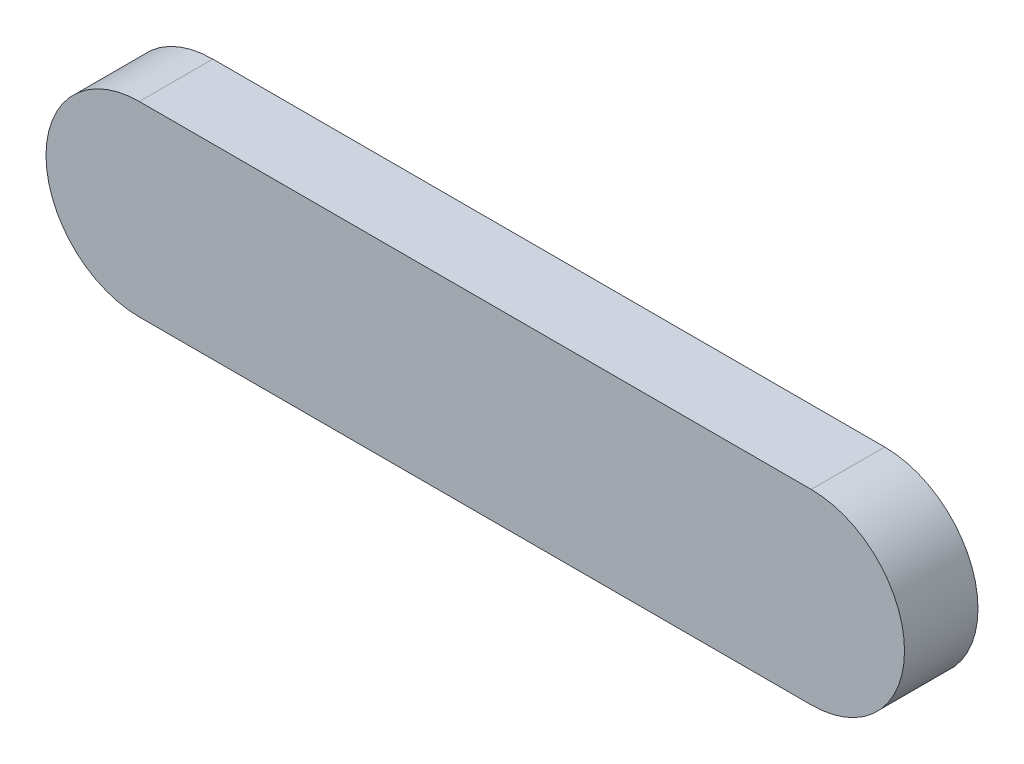
ISO-10303-21;
HEADER;
FILE_DESCRIPTION(('STEP AP214'),'2;1');
FILE_NAME('part.step','',(''),(''),'','','');
FILE_SCHEMA(('AUTOMOTIVE_DESIGN { 1 0 10303 214 1 1 1 1 }'));
ENDSEC;
DATA;
#1=APPLICATION_CONTEXT('core data for automotive mechanical design processes');
#2=APPLICATION_PROTOCOL_DEFINITION('international standard','automotive_design',2000,#1);
#3=PRODUCT_CONTEXT('',#1,'mechanical');
#4=PRODUCT('Part','Part','',(#3));
#5=PRODUCT_RELATED_PRODUCT_CATEGORY('part','',(#4));
#6=PRODUCT_DEFINITION_FORMATION('','',#4);
#7=PRODUCT_DEFINITION_CONTEXT('part definition',#1,'design');
#8=PRODUCT_DEFINITION('design','',#6,#7);
#9=PRODUCT_DEFINITION_SHAPE('','',#8);
#10=(LENGTH_UNIT() NAMED_UNIT(*) SI_UNIT(.MILLI.,.METRE.));
#11=(NAMED_UNIT(*) PLANE_ANGLE_UNIT() SI_UNIT($,.RADIAN.));
#12=(NAMED_UNIT(*) SI_UNIT($,.STERADIAN.) SOLID_ANGLE_UNIT());
#13=UNCERTAINTY_MEASURE_WITH_UNIT(LENGTH_MEASURE(1.E-05),#10,'distance_accuracy_value','');
#14=(GEOMETRIC_REPRESENTATION_CONTEXT(3) GLOBAL_UNCERTAINTY_ASSIGNED_CONTEXT((#13)) GLOBAL_UNIT_ASSIGNED_CONTEXT((#10,
#11,#12)) REPRESENTATION_CONTEXT('',''));
#15=CARTESIAN_POINT('',(0.,0.,0.));
#16=DIRECTION('',(0.,0.,1.));
#17=DIRECTION('',(1.,0.,0.));
#18=AXIS2_PLACEMENT_3D('',#15,#16,#17);
#19=CARTESIAN_POINT('',(89.7636,75.438,0.));
#20=DIRECTION('',(0.,1.,0.));
#21=DIRECTION('',(1.,0.,0.));
#22=AXIS2_PLACEMENT_3D('',#19,#20,#21);
#23=PLANE('',#22);
#24=DIRECTION('',(1.,0.,0.));
#25=VECTOR('',#24,1.);
#26=CARTESIAN_POINT('',(89.7636,75.438,0.1999996));
#27=LINE('',#26,#25);
#28=CARTESIAN_POINT('',(89.7636,75.438,0.1999996));
#29=VERTEX_POINT('',#28);
#30=CARTESIAN_POINT('',(91.5924,75.438,0.1999996));
#31=VERTEX_POINT('',#30);
#32=EDGE_CURVE('E11',#29,#31,#27,.T.);
#33=ORIENTED_EDGE('',*,*,#32,.F.);
#34=DIRECTION('',(0.,0.,1.));
#35=VECTOR('',#34,1.);
#36=CARTESIAN_POINT('',(89.7636,75.438,0.));
#37=LINE('',#36,#35);
#38=CARTESIAN_POINT('',(89.7636,75.438,0.));
#39=VERTEX_POINT('',#38);
#40=EDGE_CURVE('E24',#39,#29,#37,.T.);
#41=ORIENTED_EDGE('',*,*,#40,.F.);
#42=DIRECTION('',(1.,0.,0.));
#43=VECTOR('',#42,1.);
#44=CARTESIAN_POINT('',(89.7636,75.438,0.));
#45=LINE('',#44,#43);
#46=CARTESIAN_POINT('',(91.5924,75.438,0.));
#47=VERTEX_POINT('',#46);
#48=EDGE_CURVE('E75',#39,#47,#45,.T.);
#49=ORIENTED_EDGE('',*,*,#48,.T.);
#50=DIRECTION('',(0.,0.,1.));
#51=VECTOR('',#50,1.);
#52=CARTESIAN_POINT('',(91.5924,75.438,0.));
#53=LINE('',#52,#51);
#54=EDGE_CURVE('E37',#47,#31,#53,.T.);
#55=ORIENTED_EDGE('',*,*,#54,.T.);
#56=EDGE_LOOP('',(#33,#41,#49,#55));
#57=FACE_BOUND('',#56,.T.);
#58=ADVANCED_FACE('F17',(#57),#23,.F.);
#59=CARTESIAN_POINT('',(91.5924,75.692,0.));
#60=DIRECTION('',(0.,0.,-1.));
#61=DIRECTION('',(0.,-1.,0.));
#62=AXIS2_PLACEMENT_3D('',#59,#60,#61);
#63=CYLINDRICAL_SURFACE('',#62,0.253999999999995);
#64=CARTESIAN_POINT('',(91.5924,75.692,0.1999996));
#65=DIRECTION('',(0.,0.,1.));
#66=DIRECTION('',(0.,-1.,0.));
#67=AXIS2_PLACEMENT_3D('',#64,#65,#66);
#68=CIRCLE('',#67,0.253999999999995);
#69=CARTESIAN_POINT('',(91.5924,75.946,0.1999996));
#70=VERTEX_POINT('',#69);
#71=EDGE_CURVE('E83',#31,#70,#68,.T.);
#72=ORIENTED_EDGE('',*,*,#71,.F.);
#73=ORIENTED_EDGE('',*,*,#54,.F.);
#74=CARTESIAN_POINT('',(91.5924,75.692,0.));
#75=DIRECTION('',(0.,0.,1.));
#76=DIRECTION('',(0.,-1.,0.));
#77=AXIS2_PLACEMENT_3D('',#74,#75,#76);
#78=CIRCLE('',#77,0.253999999999995);
#79=CARTESIAN_POINT('',(91.5924,75.946,0.));
#80=VERTEX_POINT('',#79);
#81=EDGE_CURVE('E81',#47,#80,#78,.T.);
#82=ORIENTED_EDGE('',*,*,#81,.T.);
#83=DIRECTION('',(0.,0.,1.));
#84=VECTOR('',#83,1.);
#85=CARTESIAN_POINT('',(91.5924,75.946,0.));
#86=LINE('',#85,#84);
#87=EDGE_CURVE('E67',#80,#70,#86,.T.);
#88=ORIENTED_EDGE('',*,*,#87,.T.);
#89=EDGE_LOOP('',(#72,#73,#82,#88));
#90=FACE_BOUND('',#89,.T.);
#91=ADVANCED_FACE('F89',(#90),#63,.T.);
#92=CARTESIAN_POINT('',(91.5924,75.946,0.));
#93=DIRECTION('',(0.,-1.,0.));
#94=DIRECTION('',(-1.,0.,0.));
#95=AXIS2_PLACEMENT_3D('',#92,#93,#94);
#96=PLANE('',#95);
#97=DIRECTION('',(-1.,0.,0.));
#98=VECTOR('',#97,1.);
#99=CARTESIAN_POINT('',(91.5924,75.946,0.1999996));
#100=LINE('',#99,#98);
#101=CARTESIAN_POINT('',(89.7636,75.946,0.1999996));
#102=VERTEX_POINT('',#101);
#103=EDGE_CURVE('E71',#70,#102,#100,.T.);
#104=ORIENTED_EDGE('',*,*,#103,.F.);
#105=ORIENTED_EDGE('',*,*,#87,.F.);
#106=DIRECTION('',(-1.,0.,0.));
#107=VECTOR('',#106,1.);
#108=CARTESIAN_POINT('',(91.5924,75.946,0.));
#109=LINE('',#108,#107);
#110=CARTESIAN_POINT('',(89.7636,75.946,0.));
#111=VERTEX_POINT('',#110);
#112=EDGE_CURVE('E63',#80,#111,#109,.T.);
#113=ORIENTED_EDGE('',*,*,#112,.T.);
#114=DIRECTION('',(0.,0.,1.));
#115=VECTOR('',#114,1.);
#116=CARTESIAN_POINT('',(89.7636,75.946,0.));
#117=LINE('',#116,#115);
#118=EDGE_CURVE('E53',#111,#102,#117,.T.);
#119=ORIENTED_EDGE('',*,*,#118,.T.);
#120=EDGE_LOOP('',(#104,#105,#113,#119));
#121=FACE_BOUND('',#120,.T.);
#122=ADVANCED_FACE('F66',(#121),#96,.F.);
#123=CARTESIAN_POINT('',(89.7636,75.692,0.));
#124=DIRECTION('',(0.,0.,-1.));
#125=DIRECTION('',(0.,1.,0.));
#126=AXIS2_PLACEMENT_3D('',#123,#124,#125);
#127=CYLINDRICAL_SURFACE('',#126,0.253999999999995);
#128=CARTESIAN_POINT('',(89.7636,75.692,0.1999996));
#129=DIRECTION('',(0.,0.,1.));
#130=DIRECTION('',(0.,1.,0.));
#131=AXIS2_PLACEMENT_3D('',#128,#129,#130);
#132=CIRCLE('',#131,0.253999999999995);
#133=EDGE_CURVE('E59',#102,#29,#132,.T.);
#134=ORIENTED_EDGE('',*,*,#133,.F.);
#135=ORIENTED_EDGE('',*,*,#118,.F.);
#136=CARTESIAN_POINT('',(89.7636,75.692,0.));
#137=DIRECTION('',(0.,0.,1.));
#138=DIRECTION('',(0.,1.,0.));
#139=AXIS2_PLACEMENT_3D('',#136,#137,#138);
#140=CIRCLE('',#139,0.253999999999995);
#141=EDGE_CURVE('E57',#111,#39,#140,.T.);
#142=ORIENTED_EDGE('',*,*,#141,.T.);
#143=ORIENTED_EDGE('',*,*,#40,.T.);
#144=EDGE_LOOP('',(#134,#135,#142,#143));
#145=FACE_BOUND('',#144,.T.);
#146=ADVANCED_FACE('F55',(#145),#127,.T.);
#147=CARTESIAN_POINT('',(89.7636,75.438,0.));
#148=DIRECTION('',(0.,0.,-1.));
#149=DIRECTION('',(-1.,0.,0.));
#150=AXIS2_PLACEMENT_3D('',#147,#148,#149);
#151=PLANE('',#150);
#152=ORIENTED_EDGE('',*,*,#141,.F.);
#153=ORIENTED_EDGE('',*,*,#112,.F.);
#154=ORIENTED_EDGE('',*,*,#81,.F.);
#155=ORIENTED_EDGE('',*,*,#48,.F.);
#156=EDGE_LOOP('',(#152,#153,#154,#155));
#157=FACE_BOUND('',#156,.T.);
#158=ADVANCED_FACE('F74',(#157),#151,.T.);
#159=CARTESIAN_POINT('',(89.7636,75.438,0.1999996));
#160=DIRECTION('',(0.,0.,-1.));
#161=DIRECTION('',(-1.,0.,0.));
#162=AXIS2_PLACEMENT_3D('',#159,#160,#161);
#163=PLANE('',#162);
#164=ORIENTED_EDGE('',*,*,#32,.T.);
#165=ORIENTED_EDGE('',*,*,#71,.T.);
#166=ORIENTED_EDGE('',*,*,#103,.T.);
#167=ORIENTED_EDGE('',*,*,#133,.T.);
#168=EDGE_LOOP('',(#164,#165,#166,#167));
#169=FACE_BOUND('',#168,.T.);
#170=ADVANCED_FACE('F91',(#169),#163,.F.);
#171=CLOSED_SHELL('',(#58,#91,#122,#146,#158,#170));
#172=MANIFOLD_SOLID_BREP('B1',#171);
#173=ADVANCED_BREP_SHAPE_REPRESENTATION('',(#18,#172),#14);
#174=SHAPE_DEFINITION_REPRESENTATION(#9,#173);
ENDSEC;
END-ISO-10303-21;
